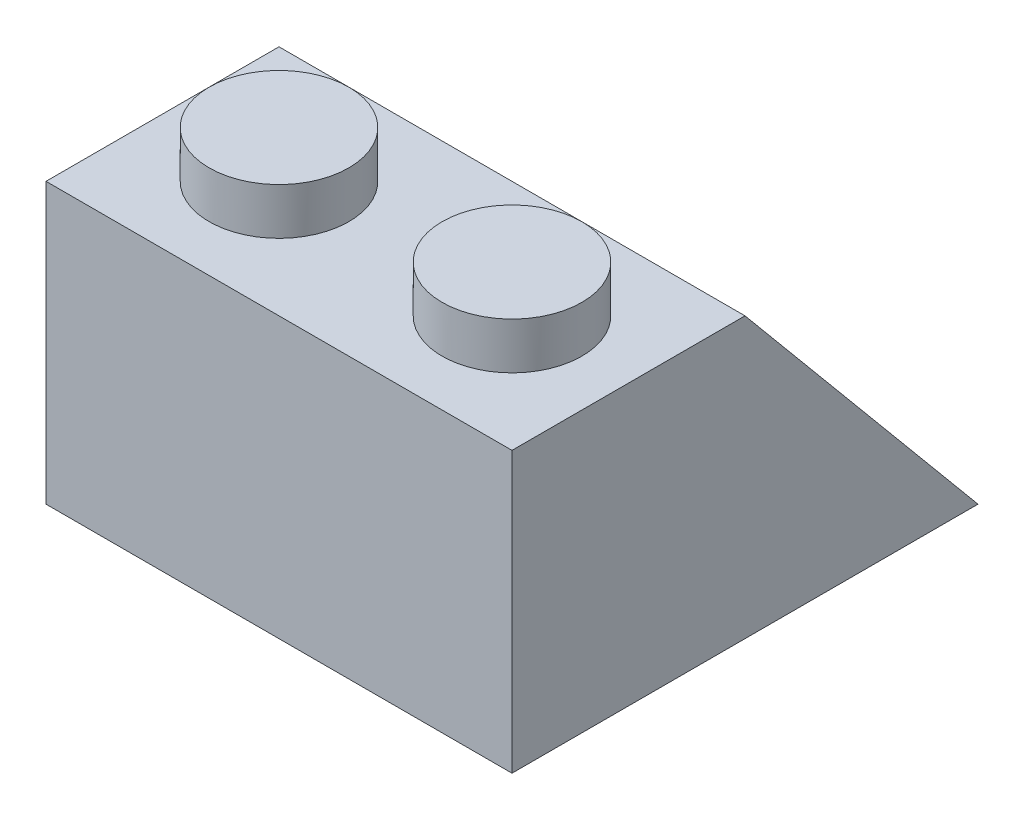
ISO-10303-21;
HEADER;
FILE_DESCRIPTION(('STEP AP214'),'2;1');
FILE_NAME('part.step','',(''),(''),'','','');
FILE_SCHEMA(('AUTOMOTIVE_DESIGN { 1 0 10303 214 1 1 1 1 }'));
ENDSEC;
DATA;
#1=APPLICATION_CONTEXT('core data for automotive mechanical design processes');
#2=APPLICATION_PROTOCOL_DEFINITION('international standard','automotive_design',2000,#1);
#3=PRODUCT_CONTEXT('',#1,'mechanical');
#4=PRODUCT('Part','Part','',(#3));
#5=PRODUCT_RELATED_PRODUCT_CATEGORY('part','',(#4));
#6=PRODUCT_DEFINITION_FORMATION('','',#4);
#7=PRODUCT_DEFINITION_CONTEXT('part definition',#1,'design');
#8=PRODUCT_DEFINITION('design','',#6,#7);
#9=PRODUCT_DEFINITION_SHAPE('','',#8);
#10=(LENGTH_UNIT() NAMED_UNIT(*) SI_UNIT(.MILLI.,.METRE.));
#11=(NAMED_UNIT(*) PLANE_ANGLE_UNIT() SI_UNIT($,.RADIAN.));
#12=(NAMED_UNIT(*) SI_UNIT($,.STERADIAN.) SOLID_ANGLE_UNIT());
#13=UNCERTAINTY_MEASURE_WITH_UNIT(LENGTH_MEASURE(1.E-05),#10,'distance_accuracy_value','');
#14=(GEOMETRIC_REPRESENTATION_CONTEXT(3) GLOBAL_UNCERTAINTY_ASSIGNED_CONTEXT((#13)) GLOBAL_UNIT_ASSIGNED_CONTEXT((#10,
#11,#12)) REPRESENTATION_CONTEXT('',''));
#15=CARTESIAN_POINT('',(0.,0.,0.));
#16=DIRECTION('',(0.,0.,1.));
#17=DIRECTION('',(1.,0.,0.));
#18=AXIS2_PLACEMENT_3D('',#15,#16,#17);
#19=CARTESIAN_POINT('',(16.,0.,0.));
#20=DIRECTION('',(0.,1.,0.));
#21=DIRECTION('',(0.,0.,1.));
#22=AXIS2_PLACEMENT_3D('',#19,#20,#21);
#23=PLANE('',#22);
#24=DIRECTION('',(0.,0.,-1.));
#25=VECTOR('',#24,1.);
#26=CARTESIAN_POINT('',(0.,0.,0.));
#27=LINE('',#26,#25);
#28=CARTESIAN_POINT('',(0.,0.,0.));
#29=VERTEX_POINT('',#28);
#30=CARTESIAN_POINT('',(0.,0.,-16.));
#31=VERTEX_POINT('',#30);
#32=EDGE_CURVE('E204',#29,#31,#27,.T.);
#33=ORIENTED_EDGE('',*,*,#32,.T.);
#34=DIRECTION('',(-1.,0.,0.));
#35=VECTOR('',#34,1.);
#36=CARTESIAN_POINT('',(16.,0.,-16.));
#37=LINE('',#36,#35);
#38=CARTESIAN_POINT('',(16.,0.,-16.));
#39=VERTEX_POINT('',#38);
#40=EDGE_CURVE('E217',#39,#31,#37,.T.);
#41=ORIENTED_EDGE('',*,*,#40,.F.);
#42=DIRECTION('',(0.,0.,-1.));
#43=VECTOR('',#42,1.);
#44=CARTESIAN_POINT('',(16.,0.,0.));
#45=LINE('',#44,#43);
#46=CARTESIAN_POINT('',(16.,0.,0.));
#47=VERTEX_POINT('',#46);
#48=EDGE_CURVE('E92',#47,#39,#45,.T.);
#49=ORIENTED_EDGE('',*,*,#48,.F.);
#50=DIRECTION('',(-1.,0.,0.));
#51=VECTOR('',#50,1.);
#52=CARTESIAN_POINT('',(16.,0.,0.));
#53=LINE('',#52,#51);
#54=EDGE_CURVE('E221',#47,#29,#53,.T.);
#55=ORIENTED_EDGE('',*,*,#54,.T.);
#56=EDGE_LOOP('',(#33,#41,#49,#55));
#57=FACE_BOUND('',#56,.T.);
#58=DIRECTION('',(0.,0.,-1.));
#59=VECTOR('',#58,1.);
#60=CARTESIAN_POINT('',(1.6,0.,0.));
#61=LINE('',#60,#59);
#62=CARTESIAN_POINT('',(1.6,0.,-1.6));
#63=VERTEX_POINT('',#62);
#64=CARTESIAN_POINT('',(1.6,0.,-13.9172667530916));
#65=VERTEX_POINT('',#64);
#66=EDGE_CURVE('E139',#63,#65,#61,.T.);
#67=ORIENTED_EDGE('',*,*,#66,.F.);
#68=DIRECTION('',(-1.,0.,0.));
#69=VECTOR('',#68,1.);
#70=CARTESIAN_POINT('',(16.,0.,-1.6));
#71=LINE('',#70,#69);
#72=CARTESIAN_POINT('',(14.4,0.,-1.6));
#73=VERTEX_POINT('',#72);
#74=EDGE_CURVE('E137',#73,#63,#71,.T.);
#75=ORIENTED_EDGE('',*,*,#74,.F.);
#76=DIRECTION('',(0.,0.,-1.));
#77=VECTOR('',#76,1.);
#78=CARTESIAN_POINT('',(14.4,0.,0.));
#79=LINE('',#78,#77);
#80=CARTESIAN_POINT('',(14.4,0.,-13.9172667530916));
#81=VERTEX_POINT('',#80);
#82=EDGE_CURVE('E150',#73,#81,#79,.T.);
#83=ORIENTED_EDGE('',*,*,#82,.T.);
#84=DIRECTION('',(-1.,0.,0.));
#85=VECTOR('',#84,1.);
#86=CARTESIAN_POINT('',(16.,0.,-13.9172667530916));
#87=LINE('',#86,#85);
#88=EDGE_CURVE('E166',#81,#65,#87,.T.);
#89=ORIENTED_EDGE('',*,*,#88,.T.);
#90=EDGE_LOOP('',(#67,#75,#83,#89));
#91=FACE_BOUND('',#90,.T.);
#92=ADVANCED_FACE('F38',(#57,#91),#23,.F.);
#93=CARTESIAN_POINT('',(16.,9.6,0.));
#94=DIRECTION('',(0.,0.,-1.));
#95=DIRECTION('',(-1.,0.,0.));
#96=AXIS2_PLACEMENT_3D('',#93,#94,#95);
#97=PLANE('',#96);
#98=DIRECTION('',(0.,-1.,0.));
#99=VECTOR('',#98,1.);
#100=CARTESIAN_POINT('',(0.,9.6,0.));
#101=LINE('',#100,#99);
#102=CARTESIAN_POINT('',(0.,9.6,0.));
#103=VERTEX_POINT('',#102);
#104=EDGE_CURVE('E189',#103,#29,#101,.T.);
#105=ORIENTED_EDGE('',*,*,#104,.T.);
#106=ORIENTED_EDGE('',*,*,#54,.F.);
#107=DIRECTION('',(0.,-1.,0.));
#108=VECTOR('',#107,1.);
#109=CARTESIAN_POINT('',(16.,9.6,0.));
#110=LINE('',#109,#108);
#111=CARTESIAN_POINT('',(16.,9.6,0.));
#112=VERTEX_POINT('',#111);
#113=EDGE_CURVE('E190',#112,#47,#110,.T.);
#114=ORIENTED_EDGE('',*,*,#113,.F.);
#115=DIRECTION('',(-1.,0.,0.));
#116=VECTOR('',#115,1.);
#117=CARTESIAN_POINT('',(16.,9.6,0.));
#118=LINE('',#117,#116);
#119=EDGE_CURVE('E200',#112,#103,#118,.T.);
#120=ORIENTED_EDGE('',*,*,#119,.T.);
#121=EDGE_LOOP('',(#105,#106,#114,#120));
#122=FACE_BOUND('',#121,.T.);
#123=ADVANCED_FACE('F40',(#122),#97,.F.);
#124=CARTESIAN_POINT('',(16.,0.,-16.));
#125=DIRECTION('',(0.,-0.64018439966448,0.768221279597376));
#126=DIRECTION('',(0.,-0.768221279597376,-0.64018439966448));
#127=AXIS2_PLACEMENT_3D('',#124,#125,#126);
#128=PLANE('',#127);
#129=DIRECTION('',(0.,0.768221279597376,0.64018439966448));
#130=VECTOR('',#129,1.);
#131=CARTESIAN_POINT('',(0.,0.,-16.));
#132=LINE('',#131,#130);
#133=CARTESIAN_POINT('',(0.,9.6,-8.));
#134=VERTEX_POINT('',#133);
#135=EDGE_CURVE('E207',#31,#134,#132,.T.);
#136=ORIENTED_EDGE('',*,*,#135,.T.);
#137=DIRECTION('',(-1.,0.,0.));
#138=VECTOR('',#137,1.);
#139=CARTESIAN_POINT('',(16.,9.6,-8.));
#140=LINE('',#139,#138);
#141=CARTESIAN_POINT('',(16.,9.6,-8.));
#142=VERTEX_POINT('',#141);
#143=EDGE_CURVE('E214',#142,#134,#140,.T.);
#144=ORIENTED_EDGE('',*,*,#143,.F.);
#145=DIRECTION('',(0.,0.768221279597376,0.64018439966448));
#146=VECTOR('',#145,1.);
#147=CARTESIAN_POINT('',(16.,0.,-16.));
#148=LINE('',#147,#146);
#149=EDGE_CURVE('E195',#39,#142,#148,.T.);
#150=ORIENTED_EDGE('',*,*,#149,.F.);
#151=ORIENTED_EDGE('',*,*,#40,.T.);
#152=EDGE_LOOP('',(#136,#144,#150,#151));
#153=FACE_BOUND('',#152,.T.);
#154=ADVANCED_FACE('F232',(#153),#128,.F.);
#155=CARTESIAN_POINT('',(16.,9.6,-8.));
#156=DIRECTION('',(0.,-1.,0.));
#157=DIRECTION('',(0.,0.,-1.));
#158=AXIS2_PLACEMENT_3D('',#155,#156,#157);
#159=PLANE('',#158);
#160=CARTESIAN_POINT('',(12.,9.6,-4.));
#161=DIRECTION('',(0.,-1.,0.));
#162=DIRECTION('',(0.,0.,-1.));
#163=AXIS2_PLACEMENT_3D('',#160,#161,#162);
#164=CIRCLE('',#163,2.4);
#165=CARTESIAN_POINT('',(12.,9.6,-6.4));
#166=VERTEX_POINT('',#165);
#167=EDGE_CURVE('E11',#166,#166,#164,.F.);
#168=ORIENTED_EDGE('',*,*,#167,.F.);
#169=EDGE_LOOP('',(#168));
#170=FACE_BOUND('',#169,.T.);
#171=CARTESIAN_POINT('',(4.,9.6,-4.));
#172=DIRECTION('',(0.,-1.,0.));
#173=DIRECTION('',(0.,0.,-1.));
#174=AXIS2_PLACEMENT_3D('',#171,#172,#173);
#175=CIRCLE('',#174,2.4);
#176=CARTESIAN_POINT('',(4.,9.6,-6.4));
#177=VERTEX_POINT('',#176);
#178=EDGE_CURVE('E47',#177,#177,#175,.F.);
#179=ORIENTED_EDGE('',*,*,#178,.F.);
#180=EDGE_LOOP('',(#179));
#181=FACE_BOUND('',#180,.T.);
#182=DIRECTION('',(0.,0.,1.));
#183=VECTOR('',#182,1.);
#184=CARTESIAN_POINT('',(0.,9.6,-8.));
#185=LINE('',#184,#183);
#186=EDGE_CURVE('E84',#134,#103,#185,.T.);
#187=ORIENTED_EDGE('',*,*,#186,.T.);
#188=ORIENTED_EDGE('',*,*,#119,.F.);
#189=DIRECTION('',(0.,0.,1.));
#190=VECTOR('',#189,1.);
#191=CARTESIAN_POINT('',(16.,9.6,-8.));
#192=LINE('',#191,#190);
#193=EDGE_CURVE('E63',#142,#112,#192,.T.);
#194=ORIENTED_EDGE('',*,*,#193,.F.);
#195=ORIENTED_EDGE('',*,*,#143,.T.);
#196=EDGE_LOOP('',(#187,#188,#194,#195));
#197=FACE_BOUND('',#196,.T.);
#198=ADVANCED_FACE('F229',(#170,#181,#197),#159,.F.);
#199=CARTESIAN_POINT('',(16.,0.,0.));
#200=DIRECTION('',(1.,0.,0.));
#201=DIRECTION('',(0.,0.,-1.));
#202=AXIS2_PLACEMENT_3D('',#199,#200,#201);
#203=PLANE('',#202);
#204=ORIENTED_EDGE('',*,*,#113,.T.);
#205=ORIENTED_EDGE('',*,*,#48,.T.);
#206=ORIENTED_EDGE('',*,*,#149,.T.);
#207=ORIENTED_EDGE('',*,*,#193,.T.);
#208=EDGE_LOOP('',(#204,#205,#206,#207));
#209=FACE_BOUND('',#208,.T.);
#210=ADVANCED_FACE('F231',(#209),#203,.T.);
#211=CARTESIAN_POINT('',(0.,0.,0.));
#212=DIRECTION('',(1.,0.,0.));
#213=DIRECTION('',(0.,0.,-1.));
#214=AXIS2_PLACEMENT_3D('',#211,#212,#213);
#215=PLANE('',#214);
#216=ORIENTED_EDGE('',*,*,#104,.F.);
#217=ORIENTED_EDGE('',*,*,#186,.F.);
#218=ORIENTED_EDGE('',*,*,#135,.F.);
#219=ORIENTED_EDGE('',*,*,#32,.F.);
#220=EDGE_LOOP('',(#216,#217,#218,#219));
#221=FACE_BOUND('',#220,.T.);
#222=ADVANCED_FACE('F239',(#221),#215,.F.);
#223=CARTESIAN_POINT('',(4.,11.2,-4.));
#224=DIRECTION('',(0.,-1.,0.));
#225=DIRECTION('',(0.,0.,-1.));
#226=AXIS2_PLACEMENT_3D('',#223,#224,#225);
#227=CYLINDRICAL_SURFACE('',#226,2.4);
#228=CARTESIAN_POINT('',(4.,11.2,-4.));
#229=DIRECTION('',(0.,1.,0.));
#230=DIRECTION('',(0.,0.,1.));
#231=AXIS2_PLACEMENT_3D('',#228,#229,#230);
#232=CIRCLE('',#231,2.4);
#233=CARTESIAN_POINT('',(4.,11.2,-1.6));
#234=VERTEX_POINT('',#233);
#235=EDGE_CURVE('E185',#234,#234,#232,.T.);
#236=ORIENTED_EDGE('',*,*,#235,.F.);
#237=EDGE_LOOP('',(#236));
#238=FACE_BOUND('',#237,.T.);
#239=ORIENTED_EDGE('',*,*,#178,.T.);
#240=EDGE_LOOP('',(#239));
#241=FACE_BOUND('',#240,.T.);
#242=ADVANCED_FACE('F227',(#238,#241),#227,.T.);
#243=CARTESIAN_POINT('',(4.,11.2,-4.));
#244=DIRECTION('',(0.,1.,0.));
#245=DIRECTION('',(0.,0.,1.));
#246=AXIS2_PLACEMENT_3D('',#243,#244,#245);
#247=PLANE('',#246);
#248=ORIENTED_EDGE('',*,*,#235,.T.);
#249=EDGE_LOOP('',(#248));
#250=FACE_BOUND('',#249,.T.);
#251=ADVANCED_FACE('F292',(#250),#247,.T.);
#252=CARTESIAN_POINT('',(12.,11.2,-4.));
#253=DIRECTION('',(0.,-1.,0.));
#254=DIRECTION('',(0.,0.,-1.));
#255=AXIS2_PLACEMENT_3D('',#252,#253,#254);
#256=CYLINDRICAL_SURFACE('',#255,2.4);
#257=CARTESIAN_POINT('',(12.,11.2,-4.));
#258=DIRECTION('',(0.,1.,0.));
#259=DIRECTION('',(0.,0.,1.));
#260=AXIS2_PLACEMENT_3D('',#257,#258,#259);
#261=CIRCLE('',#260,2.4);
#262=CARTESIAN_POINT('',(12.,11.2,-1.6));
#263=VERTEX_POINT('',#262);
#264=EDGE_CURVE('E156',#263,#263,#261,.T.);
#265=ORIENTED_EDGE('',*,*,#264,.F.);
#266=EDGE_LOOP('',(#265));
#267=FACE_BOUND('',#266,.T.);
#268=ORIENTED_EDGE('',*,*,#167,.T.);
#269=EDGE_LOOP('',(#268));
#270=FACE_BOUND('',#269,.T.);
#271=ADVANCED_FACE('F288',(#267,#270),#256,.T.);
#272=CARTESIAN_POINT('',(12.,11.2,-4.));
#273=DIRECTION('',(0.,1.,0.));
#274=DIRECTION('',(0.,0.,1.));
#275=AXIS2_PLACEMENT_3D('',#272,#273,#274);
#276=PLANE('',#275);
#277=ORIENTED_EDGE('',*,*,#264,.T.);
#278=EDGE_LOOP('',(#277));
#279=FACE_BOUND('',#278,.T.);
#280=ADVANCED_FACE('F285',(#279),#276,.T.);
#281=CARTESIAN_POINT('',(16.,9.6,-1.6));
#282=DIRECTION('',(0.,0.,-1.));
#283=DIRECTION('',(-1.,0.,0.));
#284=AXIS2_PLACEMENT_3D('',#281,#282,#283);
#285=PLANE('',#284);
#286=DIRECTION('',(0.,-1.,0.));
#287=VECTOR('',#286,1.);
#288=CARTESIAN_POINT('',(1.6,9.6,-1.6));
#289=LINE('',#288,#287);
#290=CARTESIAN_POINT('',(1.6,8.,-1.6));
#291=VERTEX_POINT('',#290);
#292=EDGE_CURVE('E119',#291,#63,#289,.T.);
#293=ORIENTED_EDGE('',*,*,#292,.F.);
#294=DIRECTION('',(-1.,0.,0.));
#295=VECTOR('',#294,1.);
#296=CARTESIAN_POINT('',(16.,8.,-1.6));
#297=LINE('',#296,#295);
#298=CARTESIAN_POINT('',(14.4,8.,-1.6));
#299=VERTEX_POINT('',#298);
#300=EDGE_CURVE('E128',#299,#291,#297,.T.);
#301=ORIENTED_EDGE('',*,*,#300,.F.);
#302=DIRECTION('',(0.,-1.,0.));
#303=VECTOR('',#302,1.);
#304=CARTESIAN_POINT('',(14.4,9.6,-1.6));
#305=LINE('',#304,#303);
#306=EDGE_CURVE('E54',#299,#73,#305,.T.);
#307=ORIENTED_EDGE('',*,*,#306,.T.);
#308=ORIENTED_EDGE('',*,*,#74,.T.);
#309=EDGE_LOOP('',(#293,#301,#307,#308));
#310=FACE_BOUND('',#309,.T.);
#311=ADVANCED_FACE('F135',(#310),#285,.T.);
#312=CARTESIAN_POINT('',(16.,-1.02429503946317,-14.7708459526442));
#313=DIRECTION('',(0.,-0.64018439966448,0.768221279597376));
#314=DIRECTION('',(0.,-0.768221279597376,-0.64018439966448));
#315=AXIS2_PLACEMENT_3D('',#312,#313,#314);
#316=PLANE('',#315);
#317=DIRECTION('',(0.,0.768221279597376,0.64018439966448));
#318=VECTOR('',#317,1.);
#319=CARTESIAN_POINT('',(1.6,-1.02429503946317,-14.7708459526442));
#320=LINE('',#319,#318);
#321=CARTESIAN_POINT('',(1.6,8.,-7.25060008642489));
#322=VERTEX_POINT('',#321);
#323=EDGE_CURVE('E122',#65,#322,#320,.T.);
#324=ORIENTED_EDGE('',*,*,#323,.F.);
#325=ORIENTED_EDGE('',*,*,#88,.F.);
#326=DIRECTION('',(0.,0.768221279597376,0.64018439966448));
#327=VECTOR('',#326,1.);
#328=CARTESIAN_POINT('',(14.4,-1.02429503946317,-14.7708459526442));
#329=LINE('',#328,#327);
#330=CARTESIAN_POINT('',(14.4,8.,-7.25060008642489));
#331=VERTEX_POINT('',#330);
#332=EDGE_CURVE('E163',#81,#331,#329,.T.);
#333=ORIENTED_EDGE('',*,*,#332,.T.);
#334=DIRECTION('',(-1.,0.,0.));
#335=VECTOR('',#334,1.);
#336=CARTESIAN_POINT('',(16.,8.,-7.25060008642489));
#337=LINE('',#336,#335);
#338=EDGE_CURVE('E133',#331,#322,#337,.T.);
#339=ORIENTED_EDGE('',*,*,#338,.T.);
#340=EDGE_LOOP('',(#324,#325,#333,#339));
#341=FACE_BOUND('',#340,.T.);
#342=ADVANCED_FACE('F254',(#341),#316,.T.);
#343=CARTESIAN_POINT('',(16.,8.,-8.));
#344=DIRECTION('',(0.,-1.,0.));
#345=DIRECTION('',(0.,0.,-1.));
#346=AXIS2_PLACEMENT_3D('',#343,#344,#345);
#347=PLANE('',#346);
#348=CARTESIAN_POINT('',(12.,8.,-4.));
#349=DIRECTION('',(0.,-1.,0.));
#350=DIRECTION('',(0.,0.,-1.));
#351=AXIS2_PLACEMENT_3D('',#348,#349,#350);
#352=CIRCLE('',#351,0.8);
#353=CARTESIAN_POINT('',(12.,8.,-4.8));
#354=VERTEX_POINT('',#353);
#355=EDGE_CURVE('E152',#354,#354,#352,.F.);
#356=ORIENTED_EDGE('',*,*,#355,.T.);
#357=EDGE_LOOP('',(#356));
#358=FACE_BOUND('',#357,.T.);
#359=CARTESIAN_POINT('',(4.,8.,-4.));
#360=DIRECTION('',(0.,-1.,0.));
#361=DIRECTION('',(0.,0.,-1.));
#362=AXIS2_PLACEMENT_3D('',#359,#360,#361);
#363=CIRCLE('',#362,0.8);
#364=CARTESIAN_POINT('',(4.,8.,-4.8));
#365=VERTEX_POINT('',#364);
#366=EDGE_CURVE('E157',#365,#365,#363,.F.);
#367=ORIENTED_EDGE('',*,*,#366,.T.);
#368=EDGE_LOOP('',(#367));
#369=FACE_BOUND('',#368,.T.);
#370=DIRECTION('',(0.,0.,1.));
#371=VECTOR('',#370,1.);
#372=CARTESIAN_POINT('',(1.6,8.,-8.));
#373=LINE('',#372,#371);
#374=EDGE_CURVE('E115',#322,#291,#373,.T.);
#375=ORIENTED_EDGE('',*,*,#374,.F.);
#376=ORIENTED_EDGE('',*,*,#338,.F.);
#377=DIRECTION('',(0.,0.,1.));
#378=VECTOR('',#377,1.);
#379=CARTESIAN_POINT('',(14.4,8.,-8.));
#380=LINE('',#379,#378);
#381=EDGE_CURVE('E131',#331,#299,#380,.T.);
#382=ORIENTED_EDGE('',*,*,#381,.T.);
#383=ORIENTED_EDGE('',*,*,#300,.T.);
#384=EDGE_LOOP('',(#375,#376,#382,#383));
#385=FACE_BOUND('',#384,.T.);
#386=ADVANCED_FACE('F129',(#358,#369,#385),#347,.T.);
#387=CARTESIAN_POINT('',(14.4,0.,0.));
#388=DIRECTION('',(1.,0.,0.));
#389=DIRECTION('',(0.,0.,-1.));
#390=AXIS2_PLACEMENT_3D('',#387,#388,#389);
#391=PLANE('',#390);
#392=ORIENTED_EDGE('',*,*,#306,.F.);
#393=ORIENTED_EDGE('',*,*,#381,.F.);
#394=ORIENTED_EDGE('',*,*,#332,.F.);
#395=ORIENTED_EDGE('',*,*,#82,.F.);
#396=EDGE_LOOP('',(#392,#393,#394,#395));
#397=FACE_BOUND('',#396,.T.);
#398=ADVANCED_FACE('F257',(#397),#391,.F.);
#399=CARTESIAN_POINT('',(1.6,0.,0.));
#400=DIRECTION('',(1.,0.,0.));
#401=DIRECTION('',(0.,0.,-1.));
#402=AXIS2_PLACEMENT_3D('',#399,#400,#401);
#403=PLANE('',#402);
#404=ORIENTED_EDGE('',*,*,#292,.T.);
#405=ORIENTED_EDGE('',*,*,#66,.T.);
#406=ORIENTED_EDGE('',*,*,#323,.T.);
#407=ORIENTED_EDGE('',*,*,#374,.T.);
#408=EDGE_LOOP('',(#404,#405,#406,#407));
#409=FACE_BOUND('',#408,.T.);
#410=ADVANCED_FACE('F117',(#409),#403,.T.);
#411=CARTESIAN_POINT('',(4.,11.2,-4.));
#412=DIRECTION('',(0.,-1.,0.));
#413=DIRECTION('',(0.,0.,-1.));
#414=AXIS2_PLACEMENT_3D('',#411,#412,#413);
#415=CYLINDRICAL_SURFACE('',#414,0.8);
#416=CARTESIAN_POINT('',(4.,9.6,-4.));
#417=DIRECTION('',(0.,1.,0.));
#418=DIRECTION('',(0.,0.,1.));
#419=AXIS2_PLACEMENT_3D('',#416,#417,#418);
#420=CIRCLE('',#419,0.8);
#421=CARTESIAN_POINT('',(4.,9.6,-3.2));
#422=VERTEX_POINT('',#421);
#423=EDGE_CURVE('E140',#422,#422,#420,.T.);
#424=ORIENTED_EDGE('',*,*,#423,.T.);
#425=EDGE_LOOP('',(#424));
#426=FACE_BOUND('',#425,.T.);
#427=ORIENTED_EDGE('',*,*,#366,.F.);
#428=EDGE_LOOP('',(#427));
#429=FACE_BOUND('',#428,.T.);
#430=ADVANCED_FACE('F264',(#426,#429),#415,.F.);
#431=CARTESIAN_POINT('',(4.,9.6,-4.));
#432=DIRECTION('',(0.,1.,0.));
#433=DIRECTION('',(0.,0.,1.));
#434=AXIS2_PLACEMENT_3D('',#431,#432,#433);
#435=PLANE('',#434);
#436=ORIENTED_EDGE('',*,*,#423,.F.);
#437=EDGE_LOOP('',(#436));
#438=FACE_BOUND('',#437,.T.);
#439=ADVANCED_FACE('F272',(#438),#435,.F.);
#440=CARTESIAN_POINT('',(12.,11.2,-4.));
#441=DIRECTION('',(0.,-1.,0.));
#442=DIRECTION('',(0.,0.,-1.));
#443=AXIS2_PLACEMENT_3D('',#440,#441,#442);
#444=CYLINDRICAL_SURFACE('',#443,0.8);
#445=CARTESIAN_POINT('',(12.,9.6,-4.));
#446=DIRECTION('',(0.,1.,0.));
#447=DIRECTION('',(0.,0.,1.));
#448=AXIS2_PLACEMENT_3D('',#445,#446,#447);
#449=CIRCLE('',#448,0.8);
#450=CARTESIAN_POINT('',(12.,9.6,-3.2));
#451=VERTEX_POINT('',#450);
#452=EDGE_CURVE('E146',#451,#451,#449,.T.);
#453=ORIENTED_EDGE('',*,*,#452,.T.);
#454=EDGE_LOOP('',(#453));
#455=FACE_BOUND('',#454,.T.);
#456=ORIENTED_EDGE('',*,*,#355,.F.);
#457=EDGE_LOOP('',(#456));
#458=FACE_BOUND('',#457,.T.);
#459=ADVANCED_FACE('F276',(#455,#458),#444,.F.);
#460=CARTESIAN_POINT('',(12.,9.6,-4.));
#461=DIRECTION('',(0.,1.,0.));
#462=DIRECTION('',(0.,0.,1.));
#463=AXIS2_PLACEMENT_3D('',#460,#461,#462);
#464=PLANE('',#463);
#465=ORIENTED_EDGE('',*,*,#452,.F.);
#466=EDGE_LOOP('',(#465));
#467=FACE_BOUND('',#466,.T.);
#468=ADVANCED_FACE('F280',(#467),#464,.F.);
#469=CLOSED_SHELL('',(#92,#123,#154,#198,#210,#222,#242,#251,#271,#280,#311,#342,#386,#398,#410,
#430,#439,#459,#468));
#470=MANIFOLD_SOLID_BREP('B2',#469);
#471=ADVANCED_BREP_SHAPE_REPRESENTATION('',(#18,#470),#14);
#472=SHAPE_DEFINITION_REPRESENTATION(#9,#471);
ENDSEC;
END-ISO-10303-21;
